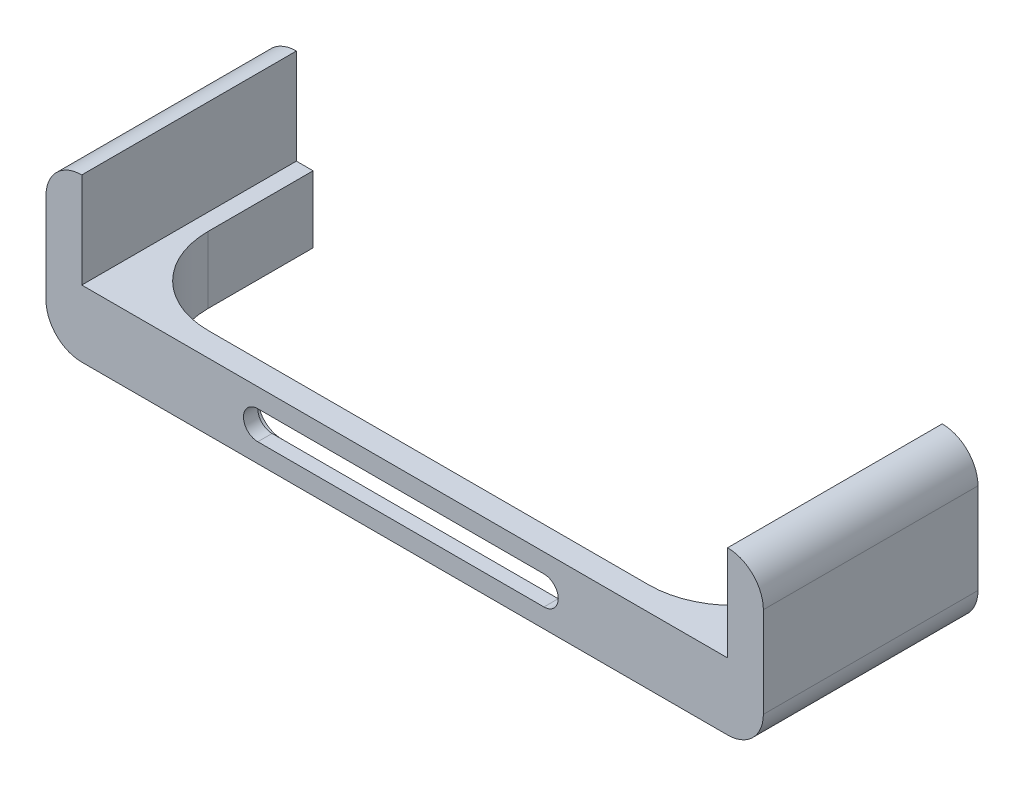
ISO-10303-21;
HEADER;
FILE_DESCRIPTION(('STEP AP214'),'2;1');
FILE_NAME('part.step','',(''),(''),'','','');
FILE_SCHEMA(('AUTOMOTIVE_DESIGN { 1 0 10303 214 1 1 1 1 }'));
ENDSEC;
DATA;
#1=APPLICATION_CONTEXT('core data for automotive mechanical design processes');
#2=APPLICATION_PROTOCOL_DEFINITION('international standard','automotive_design',2000,#1);
#3=PRODUCT_CONTEXT('',#1,'mechanical');
#4=PRODUCT('Part','Part','',(#3));
#5=PRODUCT_RELATED_PRODUCT_CATEGORY('part','',(#4));
#6=PRODUCT_DEFINITION_FORMATION('','',#4);
#7=PRODUCT_DEFINITION_CONTEXT('part definition',#1,'design');
#8=PRODUCT_DEFINITION('design','',#6,#7);
#9=PRODUCT_DEFINITION_SHAPE('','',#8);
#10=(LENGTH_UNIT() NAMED_UNIT(*) SI_UNIT(.MILLI.,.METRE.));
#11=(NAMED_UNIT(*) PLANE_ANGLE_UNIT() SI_UNIT($,.RADIAN.));
#12=(NAMED_UNIT(*) SI_UNIT($,.STERADIAN.) SOLID_ANGLE_UNIT());
#13=UNCERTAINTY_MEASURE_WITH_UNIT(LENGTH_MEASURE(1.E-05),#10,'distance_accuracy_value','');
#14=(GEOMETRIC_REPRESENTATION_CONTEXT(3) GLOBAL_UNCERTAINTY_ASSIGNED_CONTEXT((#13)) GLOBAL_UNIT_ASSIGNED_CONTEXT((#10,
#11,#12)) REPRESENTATION_CONTEXT('',''));
#15=CARTESIAN_POINT('',(0.,0.,0.));
#16=DIRECTION('',(0.,0.,1.));
#17=DIRECTION('',(1.,0.,0.));
#18=AXIS2_PLACEMENT_3D('',#15,#16,#17);
#19=CARTESIAN_POINT('',(0.,0.,-5.));
#20=DIRECTION('',(0.,0.,-1.));
#21=DIRECTION('',(-1.,0.,0.));
#22=AXIS2_PLACEMENT_3D('',#19,#20,#21);
#23=PLANE('',#22);
#24=CARTESIAN_POINT('',(29.2000000000066,-352.2,-5.));
#25=DIRECTION('',(0.,0.,-1.));
#26=DIRECTION('',(-1.,0.,0.));
#27=AXIS2_PLACEMENT_3D('',#24,#25,#26);
#28=CIRCLE('',#27,5.);
#29=CARTESIAN_POINT('',(29.2000000000066,-347.2,-5.));
#30=VERTEX_POINT('',#29);
#31=CARTESIAN_POINT('',(29.2000000000066,-357.2,-5.));
#32=VERTEX_POINT('',#31);
#33=EDGE_CURVE('E241',#30,#32,#28,.T.);
#34=ORIENTED_EDGE('',*,*,#33,.F.);
#35=DIRECTION('',(1.,0.,0.));
#36=VECTOR('',#35,1.);
#37=CARTESIAN_POINT('',(29.2000000000066,-347.2,-5.));
#38=LINE('',#37,#36);
#39=CARTESIAN_POINT('',(-30.7999999999934,-347.2,-5.));
#40=VERTEX_POINT('',#39);
#41=EDGE_CURVE('E250',#40,#30,#38,.T.);
#42=ORIENTED_EDGE('',*,*,#41,.F.);
#43=CARTESIAN_POINT('',(-30.7999999999934,-352.2,-5.));
#44=DIRECTION('',(0.,0.,-1.));
#45=DIRECTION('',(-1.,0.,0.));
#46=AXIS2_PLACEMENT_3D('',#43,#44,#45);
#47=CIRCLE('',#46,5.);
#48=CARTESIAN_POINT('',(-30.7999999999934,-357.2,-5.));
#49=VERTEX_POINT('',#48);
#50=EDGE_CURVE('E264',#49,#40,#47,.T.);
#51=ORIENTED_EDGE('',*,*,#50,.F.);
#52=DIRECTION('',(-1.,0.,0.));
#53=VECTOR('',#52,1.);
#54=CARTESIAN_POINT('',(29.2000000000066,-357.2,-5.));
#55=LINE('',#54,#53);
#56=EDGE_CURVE('E261',#32,#49,#55,.T.);
#57=ORIENTED_EDGE('',*,*,#56,.F.);
#58=EDGE_LOOP('',(#34,#42,#51,#57));
#59=FACE_BOUND('',#58,.T.);
#60=DIRECTION('',(1.,0.,0.));
#61=VECTOR('',#60,1.);
#62=CARTESIAN_POINT('',(75.2000000000066,-359.2,-5.));
#63=LINE('',#62,#61);
#64=CARTESIAN_POINT('',(-46.1999999999934,-359.2,-5.));
#65=VERTEX_POINT('',#64);
#66=CARTESIAN_POINT('',(46.2000000000066,-359.2,-5.));
#67=VERTEX_POINT('',#66);
#68=EDGE_CURVE('E317',#65,#67,#63,.T.);
#69=ORIENTED_EDGE('',*,*,#68,.F.);
#70=DIRECTION('',(0.,-1.,0.));
#71=VECTOR('',#70,1.);
#72=CARTESIAN_POINT('',(-46.1999999999931,0.,-5.));
#73=LINE('',#72,#71);
#74=CARTESIAN_POINT('',(-46.1999999999934,-345.2,-5.));
#75=VERTEX_POINT('',#74);
#76=EDGE_CURVE('E352',#65,#75,#73,.F.);
#77=ORIENTED_EDGE('',*,*,#76,.T.);
#78=DIRECTION('',(-1.,0.,0.));
#79=VECTOR('',#78,1.);
#80=CARTESIAN_POINT('',(-67.6999999999934,-345.2,-5.));
#81=LINE('',#80,#79);
#82=CARTESIAN_POINT('',(46.2000000000066,-345.2,-5.));
#83=VERTEX_POINT('',#82);
#84=EDGE_CURVE('E314',#83,#75,#81,.T.);
#85=ORIENTED_EDGE('',*,*,#84,.F.);
#86=DIRECTION('',(0.,1.,0.));
#87=VECTOR('',#86,1.);
#88=CARTESIAN_POINT('',(46.2000000000066,0.,-5.));
#89=LINE('',#88,#87);
#90=EDGE_CURVE('E350',#83,#67,#89,.F.);
#91=ORIENTED_EDGE('',*,*,#90,.T.);
#92=EDGE_LOOP('',(#69,#77,#85,#91));
#93=FACE_BOUND('',#92,.T.);
#94=ADVANCED_FACE('F39',(#59,#93),#23,.T.);
#95=CARTESIAN_POINT('',(67.7000000000066,-345.2,-5.));
#96=DIRECTION('',(-1.,0.,0.));
#97=DIRECTION('',(0.,0.,1.));
#98=AXIS2_PLACEMENT_3D('',#95,#96,#97);
#99=PLANE('',#98);
#100=DIRECTION('',(0.,-1.,0.));
#101=VECTOR('',#100,1.);
#102=CARTESIAN_POINT('',(67.7000000000066,-345.2,0.));
#103=LINE('',#102,#101);
#104=CARTESIAN_POINT('',(67.7000000000066,-325.2,0.));
#105=VERTEX_POINT('',#104);
#106=CARTESIAN_POINT('',(67.7000000000066,-345.2,0.));
#107=VERTEX_POINT('',#106);
#108=EDGE_CURVE('E313',#105,#107,#103,.T.);
#109=ORIENTED_EDGE('',*,*,#108,.F.);
#110=DIRECTION('',(0.,0.,1.));
#111=VECTOR('',#110,1.);
#112=CARTESIAN_POINT('',(67.7000000000066,-325.2,-5.));
#113=LINE('',#112,#111);
#114=CARTESIAN_POINT('',(67.7000000000066,-325.2,-45.));
#115=VERTEX_POINT('',#114);
#116=EDGE_CURVE('E338',#115,#105,#113,.T.);
#117=ORIENTED_EDGE('',*,*,#116,.F.);
#118=DIRECTION('',(0.,1.,0.));
#119=VECTOR('',#118,1.);
#120=CARTESIAN_POINT('',(67.7000000000066,-325.2,-45.));
#121=LINE('',#120,#119);
#122=CARTESIAN_POINT('',(67.7000000000066,-345.2,-45.));
#123=VERTEX_POINT('',#122);
#124=EDGE_CURVE('E286',#123,#115,#121,.T.);
#125=ORIENTED_EDGE('',*,*,#124,.F.);
#126=DIRECTION('',(0.,0.,1.));
#127=VECTOR('',#126,1.);
#128=CARTESIAN_POINT('',(67.7000000000066,-345.2,-5.));
#129=LINE('',#128,#127);
#130=EDGE_CURVE('E321',#123,#107,#129,.T.);
#131=ORIENTED_EDGE('',*,*,#130,.T.);
#132=EDGE_LOOP('',(#109,#117,#125,#131));
#133=FACE_BOUND('',#132,.T.);
#134=ADVANCED_FACE('F450',(#133),#99,.T.);
#135=CARTESIAN_POINT('',(75.2000000000066,-325.2,-5.));
#136=DIRECTION('',(1.,0.,0.));
#137=DIRECTION('',(0.,0.,-1.));
#138=AXIS2_PLACEMENT_3D('',#135,#136,#137);
#139=PLANE('',#138);
#140=DIRECTION('',(0.,-1.,0.));
#141=VECTOR('',#140,1.);
#142=CARTESIAN_POINT('',(75.2000000000066,-359.2,-45.));
#143=LINE('',#142,#141);
#144=CARTESIAN_POINT('',(75.2000000000066,-332.7,-45.));
#145=VERTEX_POINT('',#144);
#146=CARTESIAN_POINT('',(75.2000000000066,-351.7,-45.));
#147=VERTEX_POINT('',#146);
#148=EDGE_CURVE('E283',#145,#147,#143,.T.);
#149=ORIENTED_EDGE('',*,*,#148,.F.);
#150=DIRECTION('',(0.,0.,1.));
#151=VECTOR('',#150,1.);
#152=CARTESIAN_POINT('',(75.2000000000066,-332.7,-5.));
#153=LINE('',#152,#151);
#154=CARTESIAN_POINT('',(75.2000000000066,-332.7,0.));
#155=VERTEX_POINT('',#154);
#156=EDGE_CURVE('E367',#145,#155,#153,.T.);
#157=ORIENTED_EDGE('',*,*,#156,.T.);
#158=DIRECTION('',(0.,1.,0.));
#159=VECTOR('',#158,1.);
#160=CARTESIAN_POINT('',(75.2000000000066,-325.2,0.));
#161=LINE('',#160,#159);
#162=CARTESIAN_POINT('',(75.2000000000066,-351.7,0.));
#163=VERTEX_POINT('',#162);
#164=EDGE_CURVE('E318',#163,#155,#161,.T.);
#165=ORIENTED_EDGE('',*,*,#164,.F.);
#166=DIRECTION('',(0.,0.,1.));
#167=VECTOR('',#166,1.);
#168=CARTESIAN_POINT('',(75.2000000000066,-351.7,-5.));
#169=LINE('',#168,#167);
#170=EDGE_CURVE('E365',#163,#147,#169,.F.);
#171=ORIENTED_EDGE('',*,*,#170,.T.);
#172=EDGE_LOOP('',(#149,#157,#165,#171));
#173=FACE_BOUND('',#172,.T.);
#174=ADVANCED_FACE('F446',(#173),#139,.T.);
#175=CARTESIAN_POINT('',(75.2000000000066,-359.2,-5.));
#176=DIRECTION('',(0.,-1.,0.));
#177=DIRECTION('',(0.,0.,-1.));
#178=AXIS2_PLACEMENT_3D('',#175,#176,#177);
#179=PLANE('',#178);
#180=DIRECTION('',(1.,0.,0.));
#181=VECTOR('',#180,1.);
#182=CARTESIAN_POINT('',(75.2000000000066,-359.2,0.));
#183=LINE('',#182,#181);
#184=CARTESIAN_POINT('',(-67.6999999999934,-359.2,0.));
#185=VERTEX_POINT('',#184);
#186=CARTESIAN_POINT('',(67.7000000000066,-359.2,0.));
#187=VERTEX_POINT('',#186);
#188=EDGE_CURVE('E333',#185,#187,#183,.T.);
#189=ORIENTED_EDGE('',*,*,#188,.F.);
#190=DIRECTION('',(0.,0.,1.));
#191=VECTOR('',#190,1.);
#192=CARTESIAN_POINT('',(-67.6999999999934,-359.2,-5.));
#193=LINE('',#192,#191);
#194=CARTESIAN_POINT('',(-67.6999999999934,-359.2,-45.));
#195=VERTEX_POINT('',#194);
#196=EDGE_CURVE('E11',#185,#195,#193,.F.);
#197=ORIENTED_EDGE('',*,*,#196,.T.);
#198=DIRECTION('',(-1.,0.,0.));
#199=VECTOR('',#198,1.);
#200=CARTESIAN_POINT('',(-75.1999999999934,-359.2,-45.));
#201=LINE('',#200,#199);
#202=CARTESIAN_POINT('',(-64.1999999999934,-359.2,-45.));
#203=VERTEX_POINT('',#202);
#204=EDGE_CURVE('E303',#203,#195,#201,.T.);
#205=ORIENTED_EDGE('',*,*,#204,.F.);
#206=DIRECTION('',(0.,0.,1.));
#207=VECTOR('',#206,1.);
#208=CARTESIAN_POINT('',(-64.1999999999934,-359.2,-45.));
#209=LINE('',#208,#207);
#210=CARTESIAN_POINT('',(-64.1999999999934,-359.2,-23.));
#211=VERTEX_POINT('',#210);
#212=EDGE_CURVE('E307',#203,#211,#209,.T.);
#213=ORIENTED_EDGE('',*,*,#212,.T.);
#214=CARTESIAN_POINT('',(-46.1999999999934,-359.2,-23.));
#215=DIRECTION('',(0.,-1.,0.));
#216=DIRECTION('',(0.,0.,-1.));
#217=AXIS2_PLACEMENT_3D('',#214,#215,#216);
#218=CIRCLE('',#217,18.);
#219=EDGE_CURVE('E357',#211,#65,#218,.F.);
#220=ORIENTED_EDGE('',*,*,#219,.T.);
#221=ORIENTED_EDGE('',*,*,#68,.T.);
#222=CARTESIAN_POINT('',(46.2000000000066,-359.2,-23.));
#223=DIRECTION('',(0.,-1.,0.));
#224=DIRECTION('',(0.,0.,-1.));
#225=AXIS2_PLACEMENT_3D('',#222,#223,#224);
#226=CIRCLE('',#225,18.);
#227=CARTESIAN_POINT('',(64.2000000000066,-359.2,-23.));
#228=VERTEX_POINT('',#227);
#229=EDGE_CURVE('E363',#67,#228,#226,.F.);
#230=ORIENTED_EDGE('',*,*,#229,.T.);
#231=DIRECTION('',(0.,0.,1.));
#232=VECTOR('',#231,1.);
#233=CARTESIAN_POINT('',(64.2000000000066,-359.2,-45.));
#234=LINE('',#233,#232);
#235=CARTESIAN_POINT('',(64.2000000000066,-359.2,-45.));
#236=VERTEX_POINT('',#235);
#237=EDGE_CURVE('E271',#236,#228,#234,.T.);
#238=ORIENTED_EDGE('',*,*,#237,.F.);
#239=DIRECTION('',(-1.,0.,0.));
#240=VECTOR('',#239,1.);
#241=CARTESIAN_POINT('',(64.2000000000066,-359.2,-45.));
#242=LINE('',#241,#240);
#243=CARTESIAN_POINT('',(67.7000000000066,-359.2,-45.));
#244=VERTEX_POINT('',#243);
#245=EDGE_CURVE('E294',#244,#236,#242,.T.);
#246=ORIENTED_EDGE('',*,*,#245,.F.);
#247=DIRECTION('',(0.,0.,1.));
#248=VECTOR('',#247,1.);
#249=CARTESIAN_POINT('',(67.7000000000066,-359.2,-5.));
#250=LINE('',#249,#248);
#251=EDGE_CURVE('E47',#244,#187,#250,.T.);
#252=ORIENTED_EDGE('',*,*,#251,.T.);
#253=EDGE_LOOP('',(#189,#197,#205,#213,#220,#221,#230,#238,#246,#252));
#254=FACE_BOUND('',#253,.T.);
#255=ADVANCED_FACE('F392',(#254),#179,.T.);
#256=CARTESIAN_POINT('',(-75.1999999999934,-359.2,-5.));
#257=DIRECTION('',(-1.,0.,0.));
#258=DIRECTION('',(0.,0.,1.));
#259=AXIS2_PLACEMENT_3D('',#256,#257,#258);
#260=PLANE('',#259);
#261=DIRECTION('',(0.,-1.,0.));
#262=VECTOR('',#261,1.);
#263=CARTESIAN_POINT('',(-75.1999999999934,-359.2,0.));
#264=LINE('',#263,#262);
#265=CARTESIAN_POINT('',(-75.1999999999934,-332.7,0.));
#266=VERTEX_POINT('',#265);
#267=CARTESIAN_POINT('',(-75.1999999999934,-351.7,0.));
#268=VERTEX_POINT('',#267);
#269=EDGE_CURVE('E330',#266,#268,#264,.T.);
#270=ORIENTED_EDGE('',*,*,#269,.F.);
#271=DIRECTION('',(0.,0.,1.));
#272=VECTOR('',#271,1.);
#273=CARTESIAN_POINT('',(-75.1999999999934,-332.7,-5.));
#274=LINE('',#273,#272);
#275=CARTESIAN_POINT('',(-75.1999999999934,-332.7,-45.));
#276=VERTEX_POINT('',#275);
#277=EDGE_CURVE('E60',#266,#276,#274,.F.);
#278=ORIENTED_EDGE('',*,*,#277,.T.);
#279=DIRECTION('',(0.,1.,0.));
#280=VECTOR('',#279,1.);
#281=CARTESIAN_POINT('',(-75.1999999999934,-325.2,-45.));
#282=LINE('',#281,#280);
#283=CARTESIAN_POINT('',(-75.1999999999934,-351.7,-45.));
#284=VERTEX_POINT('',#283);
#285=EDGE_CURVE('E305',#284,#276,#282,.T.);
#286=ORIENTED_EDGE('',*,*,#285,.F.);
#287=DIRECTION('',(0.,0.,1.));
#288=VECTOR('',#287,1.);
#289=CARTESIAN_POINT('',(-75.1999999999934,-351.7,-5.));
#290=LINE('',#289,#288);
#291=EDGE_CURVE('E382',#284,#268,#290,.T.);
#292=ORIENTED_EDGE('',*,*,#291,.T.);
#293=EDGE_LOOP('',(#270,#278,#286,#292));
#294=FACE_BOUND('',#293,.T.);
#295=ADVANCED_FACE('F401',(#294),#260,.T.);
#296=CARTESIAN_POINT('',(-67.6999999999934,-325.2,-5.));
#297=DIRECTION('',(1.,0.,0.));
#298=DIRECTION('',(0.,0.,-1.));
#299=AXIS2_PLACEMENT_3D('',#296,#297,#298);
#300=PLANE('',#299);
#301=DIRECTION('',(0.,1.,0.));
#302=VECTOR('',#301,1.);
#303=CARTESIAN_POINT('',(-67.6999999999934,-325.2,0.));
#304=LINE('',#303,#302);
#305=CARTESIAN_POINT('',(-67.6999999999934,-345.2,0.));
#306=VERTEX_POINT('',#305);
#307=CARTESIAN_POINT('',(-67.6999999999934,-325.2,0.));
#308=VERTEX_POINT('',#307);
#309=EDGE_CURVE('E327',#306,#308,#304,.T.);
#310=ORIENTED_EDGE('',*,*,#309,.F.);
#311=DIRECTION('',(0.,0.,1.));
#312=VECTOR('',#311,1.);
#313=CARTESIAN_POINT('',(-67.6999999999934,-345.2,-5.));
#314=LINE('',#313,#312);
#315=CARTESIAN_POINT('',(-67.6999999999934,-345.2,-45.));
#316=VERTEX_POINT('',#315);
#317=EDGE_CURVE('E345',#316,#306,#314,.T.);
#318=ORIENTED_EDGE('',*,*,#317,.F.);
#319=DIRECTION('',(0.,-1.,0.));
#320=VECTOR('',#319,1.);
#321=CARTESIAN_POINT('',(-67.6999999999934,-345.2,-45.));
#322=LINE('',#321,#320);
#323=CARTESIAN_POINT('',(-67.6999999999934,-325.2,-45.));
#324=VERTEX_POINT('',#323);
#325=EDGE_CURVE('E296',#324,#316,#322,.T.);
#326=ORIENTED_EDGE('',*,*,#325,.F.);
#327=DIRECTION('',(0.,0.,1.));
#328=VECTOR('',#327,1.);
#329=CARTESIAN_POINT('',(-67.6999999999934,-325.2,-5.));
#330=LINE('',#329,#328);
#331=EDGE_CURVE('E342',#324,#308,#330,.T.);
#332=ORIENTED_EDGE('',*,*,#331,.T.);
#333=EDGE_LOOP('',(#310,#318,#326,#332));
#334=FACE_BOUND('',#333,.T.);
#335=ADVANCED_FACE('F411',(#334),#300,.T.);
#336=CARTESIAN_POINT('',(-67.6999999999934,-345.2,-5.));
#337=DIRECTION('',(0.,1.,0.));
#338=DIRECTION('',(0.,0.,1.));
#339=AXIS2_PLACEMENT_3D('',#336,#337,#338);
#340=PLANE('',#339);
#341=DIRECTION('',(-1.,0.,0.));
#342=VECTOR('',#341,1.);
#343=CARTESIAN_POINT('',(-67.6999999999934,-345.2,0.));
#344=LINE('',#343,#342);
#345=EDGE_CURVE('E324',#107,#306,#344,.T.);
#346=ORIENTED_EDGE('',*,*,#345,.F.);
#347=ORIENTED_EDGE('',*,*,#130,.F.);
#348=DIRECTION('',(1.,0.,0.));
#349=VECTOR('',#348,1.);
#350=CARTESIAN_POINT('',(67.7000000000066,-345.2,-45.));
#351=LINE('',#350,#349);
#352=CARTESIAN_POINT('',(64.2000000000066,-345.2,-45.));
#353=VERTEX_POINT('',#352);
#354=EDGE_CURVE('E289',#353,#123,#351,.T.);
#355=ORIENTED_EDGE('',*,*,#354,.F.);
#356=DIRECTION('',(0.,0.,1.));
#357=VECTOR('',#356,1.);
#358=CARTESIAN_POINT('',(64.2000000000066,-345.2,-45.));
#359=LINE('',#358,#357);
#360=CARTESIAN_POINT('',(64.2000000000066,-345.2,-23.));
#361=VERTEX_POINT('',#360);
#362=EDGE_CURVE('E280',#353,#361,#359,.T.);
#363=ORIENTED_EDGE('',*,*,#362,.T.);
#364=CARTESIAN_POINT('',(46.2000000000066,-345.2,-23.));
#365=DIRECTION('',(0.,1.,0.));
#366=DIRECTION('',(0.,0.,1.));
#367=AXIS2_PLACEMENT_3D('',#364,#365,#366);
#368=CIRCLE('',#367,18.);
#369=EDGE_CURVE('E361',#361,#83,#368,.F.);
#370=ORIENTED_EDGE('',*,*,#369,.T.);
#371=ORIENTED_EDGE('',*,*,#84,.T.);
#372=CARTESIAN_POINT('',(-46.1999999999934,-345.2,-23.));
#373=DIRECTION('',(0.,1.,0.));
#374=DIRECTION('',(0.,0.,1.));
#375=AXIS2_PLACEMENT_3D('',#372,#373,#374);
#376=CIRCLE('',#375,18.);
#377=CARTESIAN_POINT('',(-64.1999999999934,-345.2,-23.));
#378=VERTEX_POINT('',#377);
#379=EDGE_CURVE('E359',#75,#378,#376,.F.);
#380=ORIENTED_EDGE('',*,*,#379,.T.);
#381=DIRECTION('',(0.,0.,1.));
#382=VECTOR('',#381,1.);
#383=CARTESIAN_POINT('',(-64.1999999999934,-345.2,-45.));
#384=LINE('',#383,#382);
#385=CARTESIAN_POINT('',(-64.1999999999934,-345.2,-45.));
#386=VERTEX_POINT('',#385);
#387=EDGE_CURVE('E310',#386,#378,#384,.T.);
#388=ORIENTED_EDGE('',*,*,#387,.F.);
#389=DIRECTION('',(1.,0.,0.));
#390=VECTOR('',#389,1.);
#391=CARTESIAN_POINT('',(-64.1999999999934,-345.2,-45.));
#392=LINE('',#391,#390);
#393=EDGE_CURVE('E299',#316,#386,#392,.T.);
#394=ORIENTED_EDGE('',*,*,#393,.F.);
#395=ORIENTED_EDGE('',*,*,#317,.T.);
#396=EDGE_LOOP('',(#346,#347,#355,#363,#370,#371,#380,#388,#394,#395));
#397=FACE_BOUND('',#396,.T.);
#398=ADVANCED_FACE('F415',(#397),#340,.T.);
#399=CARTESIAN_POINT('',(0.,0.,0.));
#400=DIRECTION('',(0.,0.,-1.));
#401=DIRECTION('',(-1.,0.,0.));
#402=AXIS2_PLACEMENT_3D('',#399,#400,#401);
#403=PLANE('',#402);
#404=DIRECTION('',(1.,0.,0.));
#405=VECTOR('',#404,1.);
#406=CARTESIAN_POINT('',(29.2000000000066,-349.2,0.));
#407=LINE('',#406,#405);
#408=CARTESIAN_POINT('',(-30.7999999999934,-349.2,0.));
#409=VERTEX_POINT('',#408);
#410=CARTESIAN_POINT('',(29.2000000000066,-349.2,0.));
#411=VERTEX_POINT('',#410);
#412=EDGE_CURVE('E214',#409,#411,#407,.T.);
#413=ORIENTED_EDGE('',*,*,#412,.T.);
#414=CARTESIAN_POINT('',(29.2000000000066,-352.2,0.));
#415=DIRECTION('',(0.,0.,-1.));
#416=DIRECTION('',(-1.,0.,0.));
#417=AXIS2_PLACEMENT_3D('',#414,#415,#416);
#418=CIRCLE('',#417,3.);
#419=CARTESIAN_POINT('',(29.2000000000066,-355.2,0.));
#420=VERTEX_POINT('',#419);
#421=EDGE_CURVE('E206',#411,#420,#418,.T.);
#422=ORIENTED_EDGE('',*,*,#421,.T.);
#423=DIRECTION('',(-1.,0.,0.));
#424=VECTOR('',#423,1.);
#425=CARTESIAN_POINT('',(29.2000000000066,-355.2,0.));
#426=LINE('',#425,#424);
#427=CARTESIAN_POINT('',(-30.7999999999934,-355.2,0.));
#428=VERTEX_POINT('',#427);
#429=EDGE_CURVE('E218',#420,#428,#426,.T.);
#430=ORIENTED_EDGE('',*,*,#429,.T.);
#431=CARTESIAN_POINT('',(-30.7999999999934,-352.2,0.));
#432=DIRECTION('',(0.,0.,-1.));
#433=DIRECTION('',(-1.,0.,0.));
#434=AXIS2_PLACEMENT_3D('',#431,#432,#433);
#435=CIRCLE('',#434,3.);
#436=EDGE_CURVE('E222',#428,#409,#435,.T.);
#437=ORIENTED_EDGE('',*,*,#436,.T.);
#438=EDGE_LOOP('',(#413,#422,#430,#437));
#439=FACE_BOUND('',#438,.T.);
#440=ORIENTED_EDGE('',*,*,#164,.T.);
#441=CARTESIAN_POINT('',(67.7000000000066,-332.7,0.));
#442=DIRECTION('',(0.,0.,-1.));
#443=DIRECTION('',(-1.,0.,0.));
#444=AXIS2_PLACEMENT_3D('',#441,#442,#443);
#445=CIRCLE('',#444,7.5);
#446=EDGE_CURVE('E376',#155,#105,#445,.F.);
#447=ORIENTED_EDGE('',*,*,#446,.T.);
#448=ORIENTED_EDGE('',*,*,#108,.T.);
#449=ORIENTED_EDGE('',*,*,#345,.T.);
#450=ORIENTED_EDGE('',*,*,#309,.T.);
#451=CARTESIAN_POINT('',(-67.6999999999934,-332.7,0.));
#452=DIRECTION('',(0.,0.,-1.));
#453=DIRECTION('',(-1.,0.,0.));
#454=AXIS2_PLACEMENT_3D('',#451,#452,#453);
#455=CIRCLE('',#454,7.5);
#456=EDGE_CURVE('E374',#308,#266,#455,.F.);
#457=ORIENTED_EDGE('',*,*,#456,.T.);
#458=ORIENTED_EDGE('',*,*,#269,.T.);
#459=CARTESIAN_POINT('',(-67.6999999999934,-351.7,0.));
#460=DIRECTION('',(0.,0.,-1.));
#461=DIRECTION('',(-1.,0.,0.));
#462=AXIS2_PLACEMENT_3D('',#459,#460,#461);
#463=CIRCLE('',#462,7.5);
#464=EDGE_CURVE('E372',#268,#185,#463,.F.);
#465=ORIENTED_EDGE('',*,*,#464,.T.);
#466=ORIENTED_EDGE('',*,*,#188,.T.);
#467=CARTESIAN_POINT('',(67.7000000000066,-351.7,0.));
#468=DIRECTION('',(0.,0.,-1.));
#469=DIRECTION('',(-1.,0.,0.));
#470=AXIS2_PLACEMENT_3D('',#467,#468,#469);
#471=CIRCLE('',#470,7.5);
#472=EDGE_CURVE('E370',#187,#163,#471,.F.);
#473=ORIENTED_EDGE('',*,*,#472,.T.);
#474=EDGE_LOOP('',(#440,#447,#448,#449,#450,#457,#458,#465,#466,#473));
#475=FACE_BOUND('',#474,.T.);
#476=ADVANCED_FACE('F224',(#439,#475),#403,.F.);
#477=CARTESIAN_POINT('',(-64.1999999999934,-359.2,-45.));
#478=DIRECTION('',(-1.,0.,0.));
#479=DIRECTION('',(0.,-1.,0.));
#480=AXIS2_PLACEMENT_3D('',#477,#478,#479);
#481=PLANE('',#480);
#482=ORIENTED_EDGE('',*,*,#387,.T.);
#483=DIRECTION('',(0.,-1.,0.));
#484=VECTOR('',#483,1.);
#485=CARTESIAN_POINT('',(-64.1999999999934,-359.2,-23.));
#486=LINE('',#485,#484);
#487=EDGE_CURVE('E341',#378,#211,#486,.T.);
#488=ORIENTED_EDGE('',*,*,#487,.T.);
#489=ORIENTED_EDGE('',*,*,#212,.F.);
#490=DIRECTION('',(0.,-1.,0.));
#491=VECTOR('',#490,1.);
#492=CARTESIAN_POINT('',(-64.1999999999934,-359.2,-45.));
#493=LINE('',#492,#491);
#494=EDGE_CURVE('E301',#386,#203,#493,.T.);
#495=ORIENTED_EDGE('',*,*,#494,.F.);
#496=EDGE_LOOP('',(#482,#488,#489,#495));
#497=FACE_BOUND('',#496,.T.);
#498=ADVANCED_FACE('F422',(#497),#481,.F.);
#499=CARTESIAN_POINT('',(0.,0.,-45.));
#500=DIRECTION('',(0.,0.,1.));
#501=DIRECTION('',(1.,0.,0.));
#502=AXIS2_PLACEMENT_3D('',#499,#500,#501);
#503=PLANE('',#502);
#504=ORIENTED_EDGE('',*,*,#285,.T.);
#505=CARTESIAN_POINT('',(-67.6999999999934,-332.7,-45.));
#506=DIRECTION('',(0.,0.,1.));
#507=DIRECTION('',(1.,0.,0.));
#508=AXIS2_PLACEMENT_3D('',#505,#506,#507);
#509=CIRCLE('',#508,7.5);
#510=EDGE_CURVE('E388',#276,#324,#509,.F.);
#511=ORIENTED_EDGE('',*,*,#510,.T.);
#512=ORIENTED_EDGE('',*,*,#325,.T.);
#513=ORIENTED_EDGE('',*,*,#393,.T.);
#514=ORIENTED_EDGE('',*,*,#494,.T.);
#515=ORIENTED_EDGE('',*,*,#204,.T.);
#516=CARTESIAN_POINT('',(-67.6999999999934,-351.7,-45.));
#517=DIRECTION('',(0.,0.,1.));
#518=DIRECTION('',(1.,0.,0.));
#519=AXIS2_PLACEMENT_3D('',#516,#517,#518);
#520=CIRCLE('',#519,7.5);
#521=EDGE_CURVE('E386',#195,#284,#520,.F.);
#522=ORIENTED_EDGE('',*,*,#521,.T.);
#523=EDGE_LOOP('',(#504,#511,#512,#513,#514,#515,#522));
#524=FACE_BOUND('',#523,.T.);
#525=ADVANCED_FACE('F404',(#524),#503,.F.);
#526=CARTESIAN_POINT('',(64.2000000000066,-345.2,-45.));
#527=DIRECTION('',(1.,0.,0.));
#528=DIRECTION('',(0.,0.,-1.));
#529=AXIS2_PLACEMENT_3D('',#526,#527,#528);
#530=PLANE('',#529);
#531=ORIENTED_EDGE('',*,*,#237,.T.);
#532=DIRECTION('',(0.,1.,0.));
#533=VECTOR('',#532,1.);
#534=CARTESIAN_POINT('',(64.2000000000066,-345.2,-23.));
#535=LINE('',#534,#533);
#536=EDGE_CURVE('E354',#228,#361,#535,.T.);
#537=ORIENTED_EDGE('',*,*,#536,.T.);
#538=ORIENTED_EDGE('',*,*,#362,.F.);
#539=DIRECTION('',(0.,1.,0.));
#540=VECTOR('',#539,1.);
#541=CARTESIAN_POINT('',(64.2000000000066,-345.2,-45.));
#542=LINE('',#541,#540);
#543=EDGE_CURVE('E292',#236,#353,#542,.T.);
#544=ORIENTED_EDGE('',*,*,#543,.F.);
#545=EDGE_LOOP('',(#531,#537,#538,#544));
#546=FACE_BOUND('',#545,.T.);
#547=ADVANCED_FACE('F438',(#546),#530,.F.);
#548=CARTESIAN_POINT('',(0.,0.,-45.));
#549=DIRECTION('',(0.,0.,1.));
#550=DIRECTION('',(1.,0.,0.));
#551=AXIS2_PLACEMENT_3D('',#548,#549,#550);
#552=PLANE('',#551);
#553=ORIENTED_EDGE('',*,*,#124,.T.);
#554=CARTESIAN_POINT('',(67.7000000000066,-332.7,-45.));
#555=DIRECTION('',(0.,0.,1.));
#556=DIRECTION('',(1.,0.,0.));
#557=AXIS2_PLACEMENT_3D('',#554,#555,#556);
#558=CIRCLE('',#557,7.5);
#559=EDGE_CURVE('E380',#115,#145,#558,.F.);
#560=ORIENTED_EDGE('',*,*,#559,.T.);
#561=ORIENTED_EDGE('',*,*,#148,.T.);
#562=CARTESIAN_POINT('',(67.7000000000066,-351.7,-45.));
#563=DIRECTION('',(0.,0.,1.));
#564=DIRECTION('',(1.,0.,0.));
#565=AXIS2_PLACEMENT_3D('',#562,#563,#564);
#566=CIRCLE('',#565,7.5);
#567=EDGE_CURVE('E378',#147,#244,#566,.F.);
#568=ORIENTED_EDGE('',*,*,#567,.T.);
#569=ORIENTED_EDGE('',*,*,#245,.T.);
#570=ORIENTED_EDGE('',*,*,#543,.T.);
#571=ORIENTED_EDGE('',*,*,#354,.T.);
#572=EDGE_LOOP('',(#553,#560,#561,#568,#569,#570,#571));
#573=FACE_BOUND('',#572,.T.);
#574=ADVANCED_FACE('F441',(#573),#552,.F.);
#575=CARTESIAN_POINT('',(29.2000000000066,-352.2,-3.));
#576=DIRECTION('',(0.,0.,-1.));
#577=DIRECTION('',(-1.,0.,0.));
#578=AXIS2_PLACEMENT_3D('',#575,#576,#577);
#579=CYLINDRICAL_SURFACE('',#578,5.);
#580=ORIENTED_EDGE('',*,*,#33,.T.);
#581=DIRECTION('',(0.,0.,-1.));
#582=VECTOR('',#581,1.);
#583=CARTESIAN_POINT('',(29.2000000000066,-357.2,-3.));
#584=LINE('',#583,#582);
#585=CARTESIAN_POINT('',(29.2000000000066,-357.2,-3.));
#586=VERTEX_POINT('',#585);
#587=EDGE_CURVE('E259',#586,#32,#584,.T.);
#588=ORIENTED_EDGE('',*,*,#587,.F.);
#589=CARTESIAN_POINT('',(29.2000000000066,-352.2,-3.));
#590=DIRECTION('',(0.,0.,-1.));
#591=DIRECTION('',(-1.,0.,0.));
#592=AXIS2_PLACEMENT_3D('',#589,#590,#591);
#593=CIRCLE('',#592,5.);
#594=CARTESIAN_POINT('',(29.2000000000066,-347.2,-3.));
#595=VERTEX_POINT('',#594);
#596=EDGE_CURVE('E246',#595,#586,#593,.T.);
#597=ORIENTED_EDGE('',*,*,#596,.F.);
#598=DIRECTION('',(0.,0.,-1.));
#599=VECTOR('',#598,1.);
#600=CARTESIAN_POINT('',(29.2000000000066,-347.2,-3.));
#601=LINE('',#600,#599);
#602=EDGE_CURVE('E269',#595,#30,#601,.T.);
#603=ORIENTED_EDGE('',*,*,#602,.T.);
#604=EDGE_LOOP('',(#580,#588,#597,#603));
#605=FACE_BOUND('',#604,.T.);
#606=ADVANCED_FACE('F509',(#605),#579,.F.);
#607=CARTESIAN_POINT('',(29.2000000000066,-347.2,-3.));
#608=DIRECTION('',(0.,1.,0.));
#609=DIRECTION('',(0.,0.,1.));
#610=AXIS2_PLACEMENT_3D('',#607,#608,#609);
#611=PLANE('',#610);
#612=ORIENTED_EDGE('',*,*,#41,.T.);
#613=ORIENTED_EDGE('',*,*,#602,.F.);
#614=DIRECTION('',(1.,0.,0.));
#615=VECTOR('',#614,1.);
#616=CARTESIAN_POINT('',(29.2000000000066,-347.2,-3.));
#617=LINE('',#616,#615);
#618=CARTESIAN_POINT('',(-30.7999999999934,-347.2,-3.));
#619=VERTEX_POINT('',#618);
#620=EDGE_CURVE('E256',#619,#595,#617,.T.);
#621=ORIENTED_EDGE('',*,*,#620,.F.);
#622=DIRECTION('',(0.,0.,-1.));
#623=VECTOR('',#622,1.);
#624=CARTESIAN_POINT('',(-30.7999999999934,-347.2,-3.));
#625=LINE('',#624,#623);
#626=EDGE_CURVE('E272',#619,#40,#625,.T.);
#627=ORIENTED_EDGE('',*,*,#626,.T.);
#628=EDGE_LOOP('',(#612,#613,#621,#627));
#629=FACE_BOUND('',#628,.T.);
#630=ADVANCED_FACE('F505',(#629),#611,.F.);
#631=CARTESIAN_POINT('',(-30.7999999999934,-352.2,-3.));
#632=DIRECTION('',(0.,0.,-1.));
#633=DIRECTION('',(-1.,0.,0.));
#634=AXIS2_PLACEMENT_3D('',#631,#632,#633);
#635=CYLINDRICAL_SURFACE('',#634,5.);
#636=ORIENTED_EDGE('',*,*,#50,.T.);
#637=ORIENTED_EDGE('',*,*,#626,.F.);
#638=CARTESIAN_POINT('',(-30.7999999999934,-352.2,-3.));
#639=DIRECTION('',(0.,0.,-1.));
#640=DIRECTION('',(-1.,0.,0.));
#641=AXIS2_PLACEMENT_3D('',#638,#639,#640);
#642=CIRCLE('',#641,5.);
#643=CARTESIAN_POINT('',(-30.7999999999934,-357.2,-3.));
#644=VERTEX_POINT('',#643);
#645=EDGE_CURVE('E253',#644,#619,#642,.T.);
#646=ORIENTED_EDGE('',*,*,#645,.F.);
#647=DIRECTION('',(0.,0.,-1.));
#648=VECTOR('',#647,1.);
#649=CARTESIAN_POINT('',(-30.7999999999934,-357.2,-3.));
#650=LINE('',#649,#648);
#651=EDGE_CURVE('E274',#644,#49,#650,.T.);
#652=ORIENTED_EDGE('',*,*,#651,.T.);
#653=EDGE_LOOP('',(#636,#637,#646,#652));
#654=FACE_BOUND('',#653,.T.);
#655=ADVANCED_FACE('F508',(#654),#635,.F.);
#656=CARTESIAN_POINT('',(29.2000000000066,-357.2,-3.));
#657=DIRECTION('',(0.,-1.,0.));
#658=DIRECTION('',(0.,0.,-1.));
#659=AXIS2_PLACEMENT_3D('',#656,#657,#658);
#660=PLANE('',#659);
#661=ORIENTED_EDGE('',*,*,#56,.T.);
#662=ORIENTED_EDGE('',*,*,#651,.F.);
#663=DIRECTION('',(-1.,0.,0.));
#664=VECTOR('',#663,1.);
#665=CARTESIAN_POINT('',(29.2000000000066,-357.2,-3.));
#666=LINE('',#665,#664);
#667=EDGE_CURVE('E249',#586,#644,#666,.T.);
#668=ORIENTED_EDGE('',*,*,#667,.F.);
#669=ORIENTED_EDGE('',*,*,#587,.T.);
#670=EDGE_LOOP('',(#661,#662,#668,#669));
#671=FACE_BOUND('',#670,.T.);
#672=ADVANCED_FACE('F503',(#671),#660,.F.);
#673=CARTESIAN_POINT('',(29.2000000000066,-352.2,-3.));
#674=DIRECTION('',(0.,0.,-1.));
#675=DIRECTION('',(-1.,0.,0.));
#676=AXIS2_PLACEMENT_3D('',#673,#674,#675);
#677=PLANE('',#676);
#678=CARTESIAN_POINT('',(29.2000000000066,-352.2,-3.));
#679=DIRECTION('',(0.,0.,-1.));
#680=DIRECTION('',(-1.,0.,0.));
#681=AXIS2_PLACEMENT_3D('',#678,#679,#680);
#682=CIRCLE('',#681,3.);
#683=CARTESIAN_POINT('',(29.2000000000066,-349.2,-3.));
#684=VERTEX_POINT('',#683);
#685=CARTESIAN_POINT('',(29.2000000000066,-355.2,-3.));
#686=VERTEX_POINT('',#685);
#687=EDGE_CURVE('E209',#684,#686,#682,.T.);
#688=ORIENTED_EDGE('',*,*,#687,.F.);
#689=DIRECTION('',(1.,0.,0.));
#690=VECTOR('',#689,1.);
#691=CARTESIAN_POINT('',(29.2000000000066,-349.2,-3.));
#692=LINE('',#691,#690);
#693=CARTESIAN_POINT('',(-30.7999999999934,-349.2,-3.));
#694=VERTEX_POINT('',#693);
#695=EDGE_CURVE('E227',#694,#684,#692,.T.);
#696=ORIENTED_EDGE('',*,*,#695,.F.);
#697=CARTESIAN_POINT('',(-30.7999999999934,-352.2,-3.));
#698=DIRECTION('',(0.,0.,-1.));
#699=DIRECTION('',(-1.,0.,0.));
#700=AXIS2_PLACEMENT_3D('',#697,#698,#699);
#701=CIRCLE('',#700,3.);
#702=CARTESIAN_POINT('',(-30.7999999999934,-355.2,-3.));
#703=VERTEX_POINT('',#702);
#704=EDGE_CURVE('E230',#703,#694,#701,.T.);
#705=ORIENTED_EDGE('',*,*,#704,.F.);
#706=DIRECTION('',(-1.,0.,0.));
#707=VECTOR('',#706,1.);
#708=CARTESIAN_POINT('',(29.2000000000066,-355.2,-3.));
#709=LINE('',#708,#707);
#710=EDGE_CURVE('E236',#686,#703,#709,.T.);
#711=ORIENTED_EDGE('',*,*,#710,.F.);
#712=EDGE_LOOP('',(#688,#696,#705,#711));
#713=FACE_BOUND('',#712,.T.);
#714=ORIENTED_EDGE('',*,*,#596,.T.);
#715=ORIENTED_EDGE('',*,*,#667,.T.);
#716=ORIENTED_EDGE('',*,*,#645,.T.);
#717=ORIENTED_EDGE('',*,*,#620,.T.);
#718=EDGE_LOOP('',(#714,#715,#716,#717));
#719=FACE_BOUND('',#718,.T.);
#720=ADVANCED_FACE('F500',(#713,#719),#677,.T.);
#721=CARTESIAN_POINT('',(29.2000000000066,-352.2,0.));
#722=DIRECTION('',(0.,0.,-1.));
#723=DIRECTION('',(-1.,0.,0.));
#724=AXIS2_PLACEMENT_3D('',#721,#722,#723);
#725=CYLINDRICAL_SURFACE('',#724,3.);
#726=ORIENTED_EDGE('',*,*,#687,.T.);
#727=DIRECTION('',(0.,0.,-1.));
#728=VECTOR('',#727,1.);
#729=CARTESIAN_POINT('',(29.2000000000066,-355.2,0.));
#730=LINE('',#729,#728);
#731=EDGE_CURVE('E202',#420,#686,#730,.T.);
#732=ORIENTED_EDGE('',*,*,#731,.F.);
#733=ORIENTED_EDGE('',*,*,#421,.F.);
#734=DIRECTION('',(0.,0.,-1.));
#735=VECTOR('',#734,1.);
#736=CARTESIAN_POINT('',(29.2000000000066,-349.2,0.));
#737=LINE('',#736,#735);
#738=EDGE_CURVE('E239',#411,#684,#737,.T.);
#739=ORIENTED_EDGE('',*,*,#738,.T.);
#740=EDGE_LOOP('',(#726,#732,#733,#739));
#741=FACE_BOUND('',#740,.T.);
#742=ADVANCED_FACE('F204',(#741),#725,.F.);
#743=CARTESIAN_POINT('',(29.2000000000066,-349.2,0.));
#744=DIRECTION('',(0.,1.,0.));
#745=DIRECTION('',(0.,0.,1.));
#746=AXIS2_PLACEMENT_3D('',#743,#744,#745);
#747=PLANE('',#746);
#748=ORIENTED_EDGE('',*,*,#695,.T.);
#749=ORIENTED_EDGE('',*,*,#738,.F.);
#750=ORIENTED_EDGE('',*,*,#412,.F.);
#751=DIRECTION('',(0.,0.,-1.));
#752=VECTOR('',#751,1.);
#753=CARTESIAN_POINT('',(-30.7999999999934,-349.2,0.));
#754=LINE('',#753,#752);
#755=EDGE_CURVE('E242',#409,#694,#754,.T.);
#756=ORIENTED_EDGE('',*,*,#755,.T.);
#757=EDGE_LOOP('',(#748,#749,#750,#756));
#758=FACE_BOUND('',#757,.T.);
#759=ADVANCED_FACE('F493',(#758),#747,.F.);
#760=CARTESIAN_POINT('',(-30.7999999999934,-352.2,0.));
#761=DIRECTION('',(0.,0.,-1.));
#762=DIRECTION('',(-1.,0.,0.));
#763=AXIS2_PLACEMENT_3D('',#760,#761,#762);
#764=CYLINDRICAL_SURFACE('',#763,3.);
#765=ORIENTED_EDGE('',*,*,#704,.T.);
#766=ORIENTED_EDGE('',*,*,#755,.F.);
#767=ORIENTED_EDGE('',*,*,#436,.F.);
#768=DIRECTION('',(0.,0.,-1.));
#769=VECTOR('',#768,1.);
#770=CARTESIAN_POINT('',(-30.7999999999934,-355.2,0.));
#771=LINE('',#770,#769);
#772=EDGE_CURVE('E213',#428,#703,#771,.T.);
#773=ORIENTED_EDGE('',*,*,#772,.T.);
#774=EDGE_LOOP('',(#765,#766,#767,#773));
#775=FACE_BOUND('',#774,.T.);
#776=ADVANCED_FACE('F488',(#775),#764,.F.);
#777=CARTESIAN_POINT('',(29.2000000000066,-355.2,0.));
#778=DIRECTION('',(0.,-1.,0.));
#779=DIRECTION('',(0.,0.,-1.));
#780=AXIS2_PLACEMENT_3D('',#777,#778,#779);
#781=PLANE('',#780);
#782=ORIENTED_EDGE('',*,*,#710,.T.);
#783=ORIENTED_EDGE('',*,*,#772,.F.);
#784=ORIENTED_EDGE('',*,*,#429,.F.);
#785=ORIENTED_EDGE('',*,*,#731,.T.);
#786=EDGE_LOOP('',(#782,#783,#784,#785));
#787=FACE_BOUND('',#786,.T.);
#788=ADVANCED_FACE('F219',(#787),#781,.F.);
#789=CARTESIAN_POINT('',(-46.1999999999934,-359.2,-23.));
#790=DIRECTION('',(0.,-1.,0.));
#791=DIRECTION('',(1.,0.,0.));
#792=AXIS2_PLACEMENT_3D('',#789,#790,#791);
#793=CYLINDRICAL_SURFACE('',#792,18.);
#794=ORIENTED_EDGE('',*,*,#379,.F.);
#795=ORIENTED_EDGE('',*,*,#76,.F.);
#796=ORIENTED_EDGE('',*,*,#219,.F.);
#797=ORIENTED_EDGE('',*,*,#487,.F.);
#798=EDGE_LOOP('',(#794,#795,#796,#797));
#799=FACE_BOUND('',#798,.T.);
#800=ADVANCED_FACE('F432',(#799),#793,.F.);
#801=CARTESIAN_POINT('',(46.2000000000066,-345.2,-23.));
#802=DIRECTION('',(0.,1.,0.));
#803=DIRECTION('',(0.,0.,1.));
#804=AXIS2_PLACEMENT_3D('',#801,#802,#803);
#805=CYLINDRICAL_SURFACE('',#804,18.);
#806=ORIENTED_EDGE('',*,*,#229,.F.);
#807=ORIENTED_EDGE('',*,*,#90,.F.);
#808=ORIENTED_EDGE('',*,*,#369,.F.);
#809=ORIENTED_EDGE('',*,*,#536,.F.);
#810=EDGE_LOOP('',(#806,#807,#808,#809));
#811=FACE_BOUND('',#810,.T.);
#812=ADVANCED_FACE('F434',(#811),#805,.F.);
#813=CARTESIAN_POINT('',(67.7000000000066,-332.7,-5.));
#814=DIRECTION('',(0.,0.,1.));
#815=DIRECTION('',(1.,0.,0.));
#816=AXIS2_PLACEMENT_3D('',#813,#814,#815);
#817=CYLINDRICAL_SURFACE('',#816,7.5);
#818=ORIENTED_EDGE('',*,*,#559,.F.);
#819=ORIENTED_EDGE('',*,*,#116,.T.);
#820=ORIENTED_EDGE('',*,*,#446,.F.);
#821=ORIENTED_EDGE('',*,*,#156,.F.);
#822=EDGE_LOOP('',(#818,#819,#820,#821));
#823=FACE_BOUND('',#822,.T.);
#824=ADVANCED_FACE('F452',(#823),#817,.T.);
#825=CARTESIAN_POINT('',(-67.6999999999934,-332.7,-5.));
#826=DIRECTION('',(0.,0.,1.));
#827=DIRECTION('',(1.,0.,0.));
#828=AXIS2_PLACEMENT_3D('',#825,#826,#827);
#829=CYLINDRICAL_SURFACE('',#828,7.5);
#830=ORIENTED_EDGE('',*,*,#510,.F.);
#831=ORIENTED_EDGE('',*,*,#277,.F.);
#832=ORIENTED_EDGE('',*,*,#456,.F.);
#833=ORIENTED_EDGE('',*,*,#331,.F.);
#834=EDGE_LOOP('',(#830,#831,#832,#833));
#835=FACE_BOUND('',#834,.T.);
#836=ADVANCED_FACE('F408',(#835),#829,.T.);
#837=CARTESIAN_POINT('',(-67.6999999999934,-351.7,-5.));
#838=DIRECTION('',(0.,0.,1.));
#839=DIRECTION('',(1.,0.,0.));
#840=AXIS2_PLACEMENT_3D('',#837,#838,#839);
#841=CYLINDRICAL_SURFACE('',#840,7.5);
#842=ORIENTED_EDGE('',*,*,#521,.F.);
#843=ORIENTED_EDGE('',*,*,#196,.F.);
#844=ORIENTED_EDGE('',*,*,#464,.F.);
#845=ORIENTED_EDGE('',*,*,#291,.F.);
#846=EDGE_LOOP('',(#842,#843,#844,#845));
#847=FACE_BOUND('',#846,.T.);
#848=ADVANCED_FACE('F400',(#847),#841,.T.);
#849=CARTESIAN_POINT('',(67.7000000000066,-351.7,-5.));
#850=DIRECTION('',(0.,0.,1.));
#851=DIRECTION('',(1.,0.,0.));
#852=AXIS2_PLACEMENT_3D('',#849,#850,#851);
#853=CYLINDRICAL_SURFACE('',#852,7.5);
#854=ORIENTED_EDGE('',*,*,#567,.F.);
#855=ORIENTED_EDGE('',*,*,#170,.F.);
#856=ORIENTED_EDGE('',*,*,#472,.F.);
#857=ORIENTED_EDGE('',*,*,#251,.F.);
#858=EDGE_LOOP('',(#854,#855,#856,#857));
#859=FACE_BOUND('',#858,.T.);
#860=ADVANCED_FACE('F41',(#859),#853,.T.);
#861=CLOSED_SHELL('',(#94,#134,#174,#255,#295,#335,#398,#476,#498,#525,#547,#574,#606,#630,#655,
#672,#720,#742,#759,#776,#788,#800,#812,#824,#836,#848,#860));
#862=MANIFOLD_SOLID_BREP('B2',#861);
#863=ADVANCED_BREP_SHAPE_REPRESENTATION('',(#18,#862),#14);
#864=SHAPE_DEFINITION_REPRESENTATION(#9,#863);
ENDSEC;
END-ISO-10303-21;
